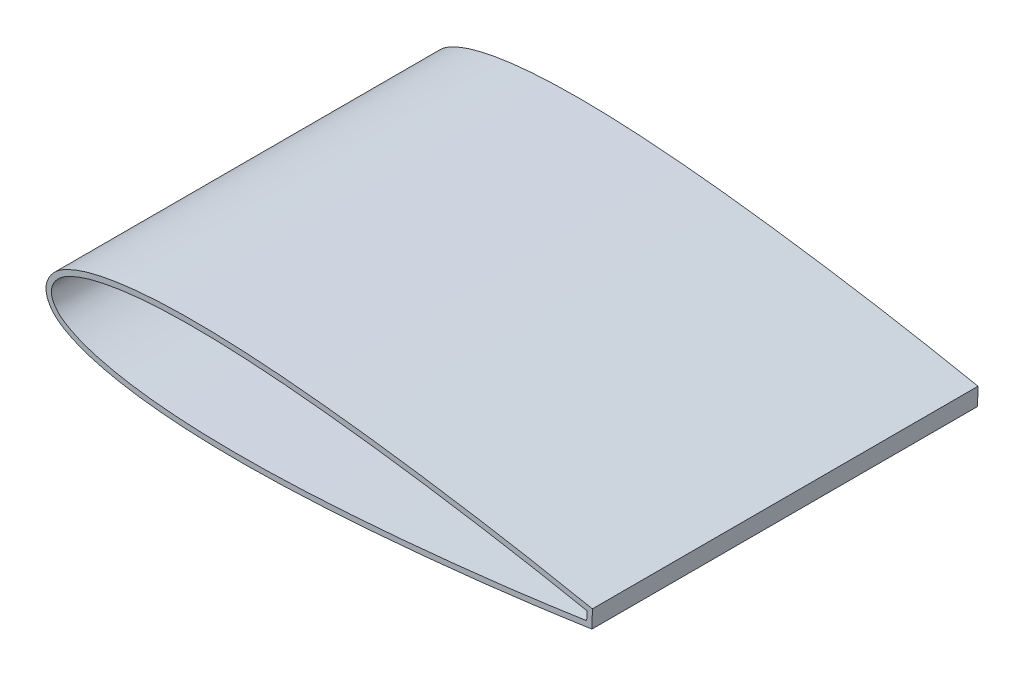
ISO-10303-21;
HEADER;
FILE_DESCRIPTION(('STEP AP214'),'2;1');
FILE_NAME('part.step','',(''),(''),'','','');
FILE_SCHEMA(('AUTOMOTIVE_DESIGN { 1 0 10303 214 1 1 1 1 }'));
ENDSEC;
DATA;
#1=APPLICATION_CONTEXT('core data for automotive mechanical design processes');
#2=APPLICATION_PROTOCOL_DEFINITION('international standard','automotive_design',2000,#1);
#3=PRODUCT_CONTEXT('',#1,'mechanical');
#4=PRODUCT('Part','Part','',(#3));
#5=PRODUCT_RELATED_PRODUCT_CATEGORY('part','',(#4));
#6=PRODUCT_DEFINITION_FORMATION('','',#4);
#7=PRODUCT_DEFINITION_CONTEXT('part definition',#1,'design');
#8=PRODUCT_DEFINITION('design','',#6,#7);
#9=PRODUCT_DEFINITION_SHAPE('','',#8);
#10=(LENGTH_UNIT() NAMED_UNIT(*) SI_UNIT(.MILLI.,.METRE.));
#11=(NAMED_UNIT(*) PLANE_ANGLE_UNIT() SI_UNIT($,.RADIAN.));
#12=(NAMED_UNIT(*) SI_UNIT($,.STERADIAN.) SOLID_ANGLE_UNIT());
#13=UNCERTAINTY_MEASURE_WITH_UNIT(LENGTH_MEASURE(1.E-05),#10,'distance_accuracy_value','');
#14=(GEOMETRIC_REPRESENTATION_CONTEXT(3) GLOBAL_UNCERTAINTY_ASSIGNED_CONTEXT((#13)) GLOBAL_UNIT_ASSIGNED_CONTEXT((#10,
#11,#12)) REPRESENTATION_CONTEXT('',''));
#15=CARTESIAN_POINT('',(0.,0.,0.));
#16=DIRECTION('',(0.,0.,1.));
#17=DIRECTION('',(1.,0.,0.));
#18=AXIS2_PLACEMENT_3D('',#15,#16,#17);
#19=CARTESIAN_POINT('',(-1.00322117115779,-0.059648781360537,70.));
#20=DIRECTION('',(0.,0.,-1.));
#21=DIRECTION('',(-1.,0.,0.));
#22=AXIS2_PLACEMENT_3D('',#19,#20,#21);
#23=PLANE('',#22);
#24=CARTESIAN_POINT('',(101.020891316469,-0.965925893531055,70.));
#25=CARTESIAN_POINT('',(96.8152914072579,-0.132900663366544,70.));
#26=CARTESIAN_POINT('',(88.3989455311931,1.49830152936529,70.));
#27=CARTESIAN_POINT('',(75.7012801730482,3.61911795290207,70.));
#28=CARTESIAN_POINT('',(65.092277680627,5.17442040629899,70.));
#29=CARTESIAN_POINT('',(56.5758124258458,6.26109804007391,70.));
#30=CARTESIAN_POINT('',(50.1729820609848,6.98171199736559,70.));
#31=CARTESIAN_POINT('',(43.7515724861816,7.59342427106694,70.));
#32=CARTESIAN_POINT('',(37.3087920994638,8.06198949486387,70.));
#33=CARTESIAN_POINT('',(30.8435273076752,8.35213974278161,70.));
#34=CARTESIAN_POINT('',(25.435555721198,8.40190442161582,70.));
#35=CARTESIAN_POINT('',(21.0964250966995,8.2838016008448,70.));
#36=CARTESIAN_POINT('',(17.8368331692398,8.09868892693585,70.));
#37=CARTESIAN_POINT('',(14.5726166555898,7.79940361911627,70.));
#38=CARTESIAN_POINT('',(11.3001793371263,7.34974690192829,70.));
#39=CARTESIAN_POINT('',(8.57843484804564,6.80839239538331,70.));
#40=CARTESIAN_POINT('',(6.39638322415199,6.23175009949422,70.));
#41=CARTESIAN_POINT('',(4.74545181220282,5.6829921152092,70.));
#42=CARTESIAN_POINT('',(3.12508064154561,4.98825619350514,70.));
#43=CARTESIAN_POINT('',(1.50276495800015,4.12004959882355,70.));
#44=CARTESIAN_POINT('',(0.0700033633555216,2.83555842326763,70.));
#45=CARTESIAN_POINT('',(-0.776195718574706,1.33145153292227,70.));
#46=CARTESIAN_POINT('',(-1.09916170922084,-0.0572333539656266,70.));
#47=CARTESIAN_POINT('',(-0.846484471488702,-1.46041080522307,70.));
#48=CARTESIAN_POINT('',(-0.0770451362163298,-3.00519348676114,70.));
#49=CARTESIAN_POINT('',(1.28926481807951,-4.36015491645666,70.));
#50=CARTESIAN_POINT('',(2.86583644744456,-5.30889764533938,70.));
#51=CARTESIAN_POINT('',(4.44919519251474,-6.08429162004691,70.));
#52=CARTESIAN_POINT('',(6.07042117395669,-6.71543040777491,70.));
#53=CARTESIAN_POINT('',(8.22069133913145,-7.40114451985403,70.));
#54=CARTESIAN_POINT('',(10.911746344812,-8.07877326924399,70.));
#55=CARTESIAN_POINT('',(14.1574108099613,-8.69253164698817,70.));
#56=CARTESIAN_POINT('',(17.4024316792176,-9.15569544258697,70.));
#57=CARTESIAN_POINT('',(20.6485790675961,-9.50459853590282,70.));
#58=CARTESIAN_POINT('',(24.9762694800653,-9.84089980940212,70.));
#59=CARTESIAN_POINT('',(30.3798939614377,-10.0633310745554,70.));
#60=CARTESIAN_POINT('',(36.8515685445446,-10.0988850430511,70.));
#61=CARTESIAN_POINT('',(43.3097651736991,-9.95511863666826,70.));
#62=CARTESIAN_POINT('',(49.7538213246545,-9.66731113762591,70.));
#63=CARTESIAN_POINT('',(56.1848018120441,-9.2698050025246,70.));
#64=CARTESIAN_POINT('',(64.7451600282889,-8.6130585330137,70.));
#65=CARTESIAN_POINT('',(75.4189859976582,-7.5935788709535,70.));
#66=CARTESIAN_POINT('',(88.2072857861862,-6.11440465250787,70.));
#67=CARTESIAN_POINT('',(96.6950523189777,-4.90878539919806,70.));
#68=CARTESIAN_POINT('',(100.937242610845,-4.288444236581,70.));
#69=B_SPLINE_CURVE_WITH_KNOTS('',3,(#24,#25,#26,#27,#28,#29,#30,#31,#32,#33,#34,#35,#36,#37,#38,
#39,#40,#41,#42,#43,#44,#45,#46,#47,#48,#49,#50,#51,#52,#53,#54,#55,#56,#57,#58,#59,#60,#61,#62,
#63,#64,#65,#66,#67,#68),.UNSPECIFIED.,.F.,.F.,(4,1,1,1,1,1,1,1,1,1,1,1,1,1,1,1,1,1,1,1,1,1,1,1,
1,1,1,1,1,1,1,1,1,1,1,1,1,1,1,1,1,1,4),(-0.00744207168561099,0.0559881872750902,
0.119418446235791,0.182848705196492,0.214563834676843,0.246278964157194,0.277994093637544,
0.309709223117895,0.341424352598245,0.373139482078596,0.388997046818771,0.404854611558947,
0.420712176299122,0.436569741039297,0.452427305779472,0.46035608814956,0.468284870519648,
0.476213652889735,0.484142435259823,0.492071217629911,0.496035608814954,0.499999999999998,
0.503964391185042,0.507928782370086,0.515857564740174,0.523786347110261,0.531715129480349,
0.539643911850436,0.547572694220524,0.563430258960699,0.579287823700875,0.59514538844105,
0.611002953181225,0.626860517921401,0.658575647401751,0.690290776882102,0.722005906362452,
0.753721035842803,0.785436165323153,0.817151294803504,0.880581553764205,0.944011812724906,
1.00744207168561),.UNSPECIFIED.);
#70=CARTESIAN_POINT('',(101.020891316469,-0.965925893531055,70.));
#71=VERTEX_POINT('',#70);
#72=CARTESIAN_POINT('',(100.937242610845,-4.288444236581,70.));
#73=VERTEX_POINT('',#72);
#74=EDGE_CURVE('E172',#71,#73,#69,.T.);
#75=ORIENTED_EDGE('',*,*,#74,.T.);
#76=DIRECTION('',(0.0251683209518781,0.999683227637867,0.));
#77=VECTOR('',#76,1.);
#78=CARTESIAN_POINT('',(100.937242610845,-4.288444236581,70.));
#79=LINE('',#78,#77);
#80=EDGE_CURVE('E85',#73,#71,#79,.T.);
#81=ORIENTED_EDGE('',*,*,#80,.T.);
#82=EDGE_LOOP('',(#75,#81));
#83=FACE_BOUND('',#82,.T.);
#84=CARTESIAN_POINT('',(100.,-1.78314077070164,70.));
#85=CARTESIAN_POINT('',(95.8344302262288,-0.958044519400651,70.));
#86=CARTESIAN_POINT('',(87.4933415029602,0.643007475734244,70.));
#87=CARTESIAN_POINT('',(74.9228307102898,2.727733466838,70.));
#88=CARTESIAN_POINT('',(62.3137388745588,4.56407590292309,70.));
#89=CARTESIAN_POINT('',(49.6568863254094,6.08476504519193,70.));
#90=CARTESIAN_POINT('',(39.060280253504,6.9894175850786,70.));
#91=CARTESIAN_POINT('',(30.5506947326384,7.35911100239499,70.));
#92=CARTESIAN_POINT('',(24.1546022363876,7.40791291697808,70.));
#93=CARTESIAN_POINT('',(18.8173066638483,7.18883232048265,70.));
#94=CARTESIAN_POINT('',(14.5521032806025,6.78995235405887,70.));
#95=CARTESIAN_POINT('',(11.3582120521434,6.34453577093204,70.));
#96=CARTESIAN_POINT('',(8.18556520798904,5.70661083590564,70.));
#97=CARTESIAN_POINT('',(5.56395062132693,4.94882342356473,70.));
#98=CARTESIAN_POINT('',(3.51112318939389,4.06369616005844,70.));
#99=CARTESIAN_POINT('',(2.04186782763618,3.26373643769958,70.));
#100=CARTESIAN_POINT('',(0.599002867417681,1.95255465334258,70.));
#101=CARTESIAN_POINT('',(-0.278987019425599,-0.0778823148154465,70.));
#102=CARTESIAN_POINT('',(0.495717549165106,-2.14992800795706,70.));
#103=CARTESIAN_POINT('',(1.87077497916579,-3.53205464081528,70.));
#104=CARTESIAN_POINT('',(3.29791442730337,-4.40493485654925,70.));
#105=CARTESIAN_POINT('',(5.30360093471831,-5.39224046874472,70.));
#106=CARTESIAN_POINT('',(7.88376183683115,-6.28098932107028,70.));
#107=CARTESIAN_POINT('',(11.0202884632237,-7.07775587557813,70.));
#108=CARTESIAN_POINT('',(14.187719714027,-7.68332699707143,70.));
#109=CARTESIAN_POINT('',(18.4274476412627,-8.29632963253289,70.));
#110=CARTESIAN_POINT('',(23.7469571658001,-8.78370910970098,70.));
#111=CARTESIAN_POINT('',(30.137402270705,-9.0568248519408,70.));
#112=CARTESIAN_POINT('',(38.6548103236351,-9.1158080666408,70.));
#113=CARTESIAN_POINT('',(49.2835144204537,-8.74553022051303,70.));
#114=CARTESIAN_POINT('',(62.0008542824053,-7.86366925984795,70.));
#115=CARTESIAN_POINT('',(74.6863778320927,-6.66415155060477,70.));
#116=CARTESIAN_POINT('',(87.3458680501336,-5.21462353571256,70.));
#117=CARTESIAN_POINT('',(95.7569555936226,-4.03532929069693,70.));
#118=CARTESIAN_POINT('',(99.9587674720381,-3.42089271750701,70.));
#119=B_SPLINE_CURVE_WITH_KNOTS('',3,(#84,#85,#86,#87,#88,#89,#90,#91,#92,#93,#94,#95,#96,#97,
#98,#99,#100,#101,#102,#103,#104,#105,#106,#107,#108,#109,#110,#111,#112,#113,#114,#115,#116,
#117,#118),.UNSPECIFIED.,.F.,.F.,(4,1,1,1,1,1,1,1,1,1,1,1,1,1,1,1,1,1,1,1,1,1,1,1,1,1,1,1,1,1,1,
1,4),(-0.00328090173750234,0.0596292109796854,0.122539323696873,0.185449436414061,
0.248359549131249,0.311269661848436,0.34272471820703,0.374179774565624,0.405634830924218,
0.421362359103515,0.437089887282812,0.452817415462109,0.468544943641406,0.476408707731054,
0.484272471820703,0.492136235910351,0.5,0.507863764089648,0.515727528179296,0.523591292268945,
0.531455056358593,0.54718258453789,0.562910112717187,0.578637640896484,0.594365169075781,
0.625820225434375,0.657275281792969,0.688730338151563,0.75164045086875,0.814550563585938,
0.877460676303126,0.940370789020314,1.0032809017375),.UNSPECIFIED.);
#120=CARTESIAN_POINT('',(100.,-1.78314077070164,70.));
#121=VERTEX_POINT('',#120);
#122=CARTESIAN_POINT('',(99.9587674720381,-3.42089271750701,70.));
#123=VERTEX_POINT('',#122);
#124=EDGE_CURVE('E101',#121,#123,#119,.T.);
#125=ORIENTED_EDGE('',*,*,#124,.F.);
#126=DIRECTION('',(0.0251683209517833,0.999683227637869,0.));
#127=VECTOR('',#126,1.);
#128=CARTESIAN_POINT('',(99.9587674720381,-3.42089271750701,70.));
#129=LINE('',#128,#127);
#130=EDGE_CURVE('E175',#123,#121,#129,.T.);
#131=ORIENTED_EDGE('',*,*,#130,.F.);
#132=EDGE_LOOP('',(#125,#131));
#133=FACE_BOUND('',#132,.T.);
#134=ADVANCED_FACE('F37',(#83,#133),#23,.F.);
#135=DIRECTION('',(0.,0.,-1.));
#136=VECTOR('',#135,1.);
#137=SURFACE_OF_LINEAR_EXTRUSION('',#69,#136);
#138=DIRECTION('',(0.,0.,-1.));
#139=VECTOR('',#138,1.);
#140=CARTESIAN_POINT('',(101.020891316469,-0.965925893531055,70.));
#141=LINE('',#140,#139);
#142=CARTESIAN_POINT('',(101.020891316469,-0.965925893531055,-2.));
#143=VERTEX_POINT('',#142);
#144=EDGE_CURVE('E47',#71,#143,#141,.T.);
#145=ORIENTED_EDGE('',*,*,#144,.T.);
#146=CARTESIAN_POINT('',(100.937242610845,-4.288444236581,-2.));
#147=CARTESIAN_POINT('',(99.876048925615,-4.4436211339548,-2.));
#148=CARTESIAN_POINT('',(98.814696636485,-4.59771294948539,-2.));
#149=CARTESIAN_POINT('',(96.6914939606541,-4.90253918519001,-2.));
#150=CARTESIAN_POINT('',(95.6296435665199,-5.05327355351854,-2.));
#151=CARTESIAN_POINT('',(92.414428288785,-5.50266307594665,-2.));
#152=CARTESIAN_POINT('',(90.2600588829281,-5.79424652564887,-2.));
#153=CARTESIAN_POINT('',(85.9245235779079,-6.35198444563104,-2.));
#154=CARTESIAN_POINT('',(83.7433180801583,-6.61783267319582,-2.));
#155=CARTESIAN_POINT('',(80.8271914517352,-6.95601395759061,-2.));
#156=CARTESIAN_POINT('',(80.0935569438925,-7.03963685425996,-2.));
#157=CARTESIAN_POINT('',(78.625978708156,-7.20412971058293,-2.));
#158=CARTESIAN_POINT('',(77.8920349805453,-7.28499967274979,-2.));
#159=CARTESIAN_POINT('',(76.4238645459665,-7.44412739835826,-2.));
#160=CARTESIAN_POINT('',(75.6896378388321,-7.52238516026244,-2.));
#161=CARTESIAN_POINT('',(74.2168187936958,-7.67680505678082,-2.));
#162=CARTESIAN_POINT('',(73.4782249720661,-7.75295304918208,-2.));
#163=CARTESIAN_POINT('',(72.00076568911,-7.9025627792338,-2.));
#164=CARTESIAN_POINT('',(71.2619002279724,-7.97602451874753,-2.));
#165=CARTESIAN_POINT('',(69.7838971676636,-8.12015649853246,-2.));
#166=CARTESIAN_POINT('',(69.0447595685713,-8.19082673961318,-2.));
#167=CARTESIAN_POINT('',(67.5639140885411,-8.32947983944264,-2.));
#168=CARTESIAN_POINT('',(66.8222053609176,-8.3974536601769,-2.));
#169=CARTESIAN_POINT('',(65.3385154183688,-8.53036762632486,-2.));
#170=CARTESIAN_POINT('',(64.5965342032507,-8.59530776958765,-2.));
#171=CARTESIAN_POINT('',(63.1123030068729,-8.72205425840304,-2.));
#172=CARTESIAN_POINT('',(62.3700530251867,-8.78386059896168,-2.));
#173=CARTESIAN_POINT('',(60.6702961791958,-8.92160579938587,-2.));
#174=CARTESIAN_POINT('',(59.7127005835631,-8.99645400199829,-2.));
#175=CARTESIAN_POINT('',(57.7970604804058,-9.14019925022991,-2.));
#176=CARTESIAN_POINT('',(56.8390159721293,-9.20909628584681,-2.));
#177=CARTESIAN_POINT('',(54.9224815960169,-9.3404862507936,-2.));
#178=CARTESIAN_POINT('',(53.963991725804,-9.40297914554104,-2.));
#179=CARTESIAN_POINT('',(52.0480243573676,-9.52102582384489,-2.));
#180=CARTESIAN_POINT('',(51.0905474917283,-9.57658985564231,-2.));
#181=CARTESIAN_POINT('',(49.1752024645996,-9.68049541975074,-2.));
#182=CARTESIAN_POINT('',(48.2173343040052,-9.7288369684912,-2.));
#183=CARTESIAN_POINT('',(46.301222240332,-9.81734757016264,-2.));
#184=CARTESIAN_POINT('',(45.3429783391351,-9.85751666351474,-2.));
#185=CARTESIAN_POINT('',(43.4299788037973,-9.92852706077323,-2.));
#186=CARTESIAN_POINT('',(42.4752245430876,-9.95940502148034,-2.));
#187=CARTESIAN_POINT('',(40.5654332341082,-10.0110396013984,-2.));
#188=CARTESIAN_POINT('',(39.6103961841864,-10.0317961602639,-2.));
#189=CARTESIAN_POINT('',(37.7001124363002,-10.0622188611542,-2.));
#190=CARTESIAN_POINT('',(36.7448657328417,-10.0718846657635,-2.));
#191=CARTESIAN_POINT('',(34.8399271822113,-10.0789333306864,-2.));
#192=CARTESIAN_POINT('',(33.8902356339696,-10.07638793968,-2.));
#193=CARTESIAN_POINT('',(31.9910003729539,-10.0576988781726,-2.));
#194=CARTESIAN_POINT('',(31.0414566573591,-10.0415555104423,-2.));
#195=CARTESIAN_POINT('',(29.1427979240686,-9.99419598040804,-2.));
#196=CARTESIAN_POINT('',(28.1936828827641,-9.96298078584784,-2.));
#197=CARTESIAN_POINT('',(26.3021931574134,-9.88332472157658,-2.));
#198=CARTESIAN_POINT('',(25.3598139594559,-9.83499454882057,-2.));
#199=CARTESIAN_POINT('',(23.9471140796724,-9.74792782522012,-2.));
#200=CARTESIAN_POINT('',(23.4763378162684,-9.71647526681721,-2.));
#201=CARTESIAN_POINT('',(22.5351630224023,-9.64832166745369,-2.));
#202=CARTESIAN_POINT('',(22.0647644912443,-9.61162063618499,-2.));
#203=CARTESIAN_POINT('',(21.1242817734579,-9.53248170069778,-2.));
#204=CARTESIAN_POINT('',(20.6541977560653,-9.49004177897489,-2.));
#205=CARTESIAN_POINT('',(19.71462451384,-9.39898768365309,-2.));
#206=CARTESIAN_POINT('',(19.2451352907087,-9.35037349243266,-2.));
#207=CARTESIAN_POINT('',(18.3075421216353,-9.24660106610844,-2.));
#208=CARTESIAN_POINT('',(17.8394371568319,-9.19145205787048,-2.));
#209=CARTESIAN_POINT('',(16.9041073805686,-9.07412341499306,-2.));
#210=CARTESIAN_POINT('',(16.4368825654825,-9.01194380938506,-2.));
#211=CARTESIAN_POINT('',(15.5036744025738,-8.87966017559813,-2.));
#212=CARTESIAN_POINT('',(15.0376907650058,-8.80955820041357,-2.));
#213=CARTESIAN_POINT('',(14.1071066800859,-8.66061366014942,-2.));
#214=CARTESIAN_POINT('',(13.6425062588231,-8.581770931269,-2.));
#215=CARTESIAN_POINT('',(12.7153359850571,-8.41428129474856,-2.));
#216=CARTESIAN_POINT('',(12.25276514888,-8.32563985151775,-2.));
#217=CARTESIAN_POINT('',(11.3298756998091,-8.13738305144831,-2.));
#218=CARTESIAN_POINT('',(10.8695569340212,-8.03776845069016,-2.));
#219=CARTESIAN_POINT('',(10.22553393746,-7.88932798146915,-2.));
#220=CARTESIAN_POINT('',(10.0406338963462,-7.8456551498437,-2.));
#221=CARTESIAN_POINT('',(9.67135119516788,-7.7561671084356,-2.));
#222=CARTESIAN_POINT('',(9.48696853579342,-7.71035189579696,-2.));
#223=CARTESIAN_POINT('',(9.11869524732595,-7.61645227282149,-2.));
#224=CARTESIAN_POINT('',(8.93480487068835,-7.56836687200275,-2.));
#225=CARTESIAN_POINT('',(8.56765557034172,-7.46983738138947,-2.));
#226=CARTESIAN_POINT('',(8.38439664951345,-7.4193932808495,-2.));
#227=CARTESIAN_POINT('',(8.01849150978227,-7.31603082083331,-2.));
#228=CARTESIAN_POINT('',(7.83584559241313,-7.26311139355718,-2.));
#229=CARTESIAN_POINT('',(7.4713135254854,-7.15471288388027,-2.));
#230=CARTESIAN_POINT('',(7.28942737513937,-7.09923380413313,-2.));
#231=CARTESIAN_POINT('',(6.92773305059613,-6.9856161217389,-2.));
#232=CARTESIAN_POINT('',(6.74791899369977,-6.92749630352489,-2.));
#233=CARTESIAN_POINT('',(6.38941236233546,-6.8078900719144,-2.));
#234=CARTESIAN_POINT('',(6.21071978286423,-6.74640367354928,-2.));
#235=CARTESIAN_POINT('',(5.85470953445288,-6.61974436233808,-2.));
#236=CARTESIAN_POINT('',(5.67739143124323,-6.55457267276336,-2.));
#237=CARTESIAN_POINT('',(5.32428879883447,-6.42018556765714,-2.));
#238=CARTESIAN_POINT('',(5.14850428613118,-6.35097010869098,-2.));
#239=CARTESIAN_POINT('',(4.79882253712284,-6.20819925974412,-2.));
#240=CARTESIAN_POINT('',(4.62492425910159,-6.13464642657308,-2.));
#241=CARTESIAN_POINT('',(4.27920356950343,-5.98282910878774,-2.));
#242=CARTESIAN_POINT('',(4.10738104820209,-5.90456487453794,-2.));
#243=CARTESIAN_POINT('',(3.80722175508821,-5.76280917825111,-2.));
#244=CARTESIAN_POINT('',(3.67841097867518,-5.70031855927824,-2.));
#245=CARTESIAN_POINT('',(3.4221087087578,-5.57264914020639,-2.));
#246=CARTESIAN_POINT('',(3.29461736121043,-5.50747004659805,-2.));
#247=CARTESIAN_POINT('',(3.10441239893892,-5.40770963031091,-2.));
#248=CARTESIAN_POINT('',(3.04117625121146,-5.37412060938886,-2.));
#249=CARTESIAN_POINT('',(2.91504702696523,-5.30630318968236,-2.));
#250=CARTESIAN_POINT('',(2.85215395230048,-5.272074787447,-2.));
#251=CARTESIAN_POINT('',(2.72666909264015,-5.20285942465438,-2.));
#252=CARTESIAN_POINT('',(2.66407786189751,-5.16787145650822,-2.));
#253=CARTESIAN_POINT('',(2.53941073575201,-5.09699051789263,-2.));
#254=CARTESIAN_POINT('',(2.47733483663516,-5.06109755395305,-2.));
#255=CARTESIAN_POINT('',(2.29207134962473,-4.95185066688746,-2.));
#256=CARTESIAN_POINT('',(2.16981056765025,-4.87690838276518,-2.));
#257=CARTESIAN_POINT('',(1.92857325958476,-4.72188171766794,-2.));
#258=CARTESIAN_POINT('',(1.80959677771728,-4.6417972675013,-2.));
#259=CARTESIAN_POINT('',(1.60337873003884,-4.49573125412541,-2.));
#260=CARTESIAN_POINT('',(1.51530993346956,-4.43091635426724,-2.));
#261=CARTESIAN_POINT('',(1.34164967731459,-4.29803544375862,-2.));
#262=CARTESIAN_POINT('',(1.25605837460725,-4.22996922795044,-2.));
#263=CARTESIAN_POINT('',(1.08759236708112,-4.09053614288333,-2.));
#264=CARTESIAN_POINT('',(1.00471775323439,-4.01916916328633,-2.));
#265=CARTESIAN_POINT('',(0.842105846147469,-3.87296535515805,-2.));
#266=CARTESIAN_POINT('',(0.762368466811954,-3.79812862197039,-2.));
#267=CARTESIAN_POINT('',(0.528935311284787,-3.56872521672869,-2.));
#268=CARTESIAN_POINT('',(0.380406115191541,-3.4087649573069,-2.));
#269=CARTESIAN_POINT('',(0.170433747776414,-3.15806010213646,-2.));
#270=CARTESIAN_POINT('',(0.102542710448644,-3.07264284738384,-2.));
#271=CARTESIAN_POINT('',(-0.0285936445398048,-2.89828399003354,-2.));
#272=CARTESIAN_POINT('',(-0.0918383972224047,-2.80934196084857,-2.));
#273=CARTESIAN_POINT('',(-0.227855947050874,-2.60649887125939,-2.));
#274=CARTESIAN_POINT('',(-0.299303446172271,-2.4917045016565,-2.));
#275=CARTESIAN_POINT('',(-0.433672746651762,-2.25718981273116,-2.));
#276=CARTESIAN_POINT('',(-0.496593411620822,-2.13746883959625,-2.));
#277=CARTESIAN_POINT('',(-0.612676629374555,-1.89360961589938,-2.));
#278=CARTESIAN_POINT('',(-0.665855266231681,-1.76947905767002,-2.));
#279=CARTESIAN_POINT('',(-0.761627133561068,-1.51724897754466,-2.));
#280=CARTESIAN_POINT('',(-0.804225677997618,-1.38915148459394,-2.));
#281=CARTESIAN_POINT('',(-0.871275207908976,-1.15373054155264,-2.));
#282=CARTESIAN_POINT('',(-0.897625372054255,-1.04694597473237,-2.));
#283=CARTESIAN_POINT('',(-0.942200613019407,-0.831714348481063,-2.));
#284=CARTESIAN_POINT('',(-0.960428262440093,-0.723267826704657,-2.));
#285=CARTESIAN_POINT('',(-0.987902293580838,-0.50548782878387,-2.));
#286=CARTESIAN_POINT('',(-0.997171778970058,-0.396157371529362,-2.));
#287=CARTESIAN_POINT('',(-1.00367190316051,-0.231902019736166,-2.));
#288=CARTESIAN_POINT('',(-1.00460466447592,-0.177108357912547,-2.));
#289=CARTESIAN_POINT('',(-1.00384052398554,-0.0675363984626097,-2.));
#290=CARTESIAN_POINT('',(-1.0021436952514,-0.0127581004516642,-2.00000000000002));
#291=CARTESIAN_POINT('',(-0.996159180301451,0.096701553651138,-2.00000000000002));
#292=CARTESIAN_POINT('',(-0.991869284901761,0.15138278716367,-2.));
#293=CARTESIAN_POINT('',(-0.980858577191678,0.260497876243125,-2.));
#294=CARTESIAN_POINT('',(-0.974137640031922,0.314931718959561,-2.));
#295=CARTESIAN_POINT('',(-0.950511890623783,0.47776889844627,-2.));
#296=CARTESIAN_POINT('',(-0.93014552215099,0.585684615010245,-2.));
#297=CARTESIAN_POINT('',(-0.88103884192028,0.799928881999769,-2.));
#298=CARTESIAN_POINT('',(-0.852271468574693,0.906251117221291,-2.));
#299=CARTESIAN_POINT('',(-0.787121812620898,1.11650917490412,-2.));
#300=CARTESIAN_POINT('',(-0.750740462559891,1.22044528788534,-2.00000000000001));
#301=CARTESIAN_POINT('',(-0.657265051090361,1.46033354528192,-2.00000000000002));
#302=CARTESIAN_POINT('',(-0.597331225874358,1.59518628943953,-2.));
#303=CARTESIAN_POINT('',(-0.465750229355705,1.85906509550025,-2.));
#304=CARTESIAN_POINT('',(-0.394099003702713,1.98808912081066,-2.));
#305=CARTESIAN_POINT('',(-0.240606174155722,2.23968208078803,-2.));
#306=CARTESIAN_POINT('',(-0.158776929852478,2.36225859234919,-2.));
#307=CARTESIAN_POINT('',(0.0137911666137622,2.60094478424662,-2.));
#308=CARTESIAN_POINT('',(0.104530366041761,2.71705421225205,-2.));
#309=CARTESIAN_POINT('',(0.32809890811802,2.98281821923955,-2.));
#310=CARTESIAN_POINT('',(0.464364167277283,3.12959472456311,-2.));
#311=CARTESIAN_POINT('',(0.749470370516614,3.41033276517798,-2.));
#312=CARTESIAN_POINT('',(0.898314528379842,3.54429100677714,-2.));
#313=CARTESIAN_POINT('',(1.20656274462563,3.80024481616814,-2.));
#314=CARTESIAN_POINT('',(1.36599317539223,3.92220847525983,-2.));
#315=CARTESIAN_POINT('',(1.61110268252865,4.09667354153988,-2.));
#316=CARTESIAN_POINT('',(1.69380844276444,4.15342043826633,-2.));
#317=CARTESIAN_POINT('',(1.86110499970898,4.26406294999952,-2.));
#318=CARTESIAN_POINT('',(1.9456956908955,4.31795872405075,-2.));
#319=CARTESIAN_POINT('',(2.14152262737607,4.43831739978814,-2.));
#320=CARTESIAN_POINT('',(2.25332729566672,4.50385491726743,-2.));
#321=CARTESIAN_POINT('',(2.47928619730091,4.6307529299799,-2.));
#322=CARTESIAN_POINT('',(2.59344068837807,4.69211296380412,-2.));
#323=CARTESIAN_POINT('',(2.82367822580222,4.81146621223148,-2.));
#324=CARTESIAN_POINT('',(2.93976364055447,4.86945482878919,-2.));
#325=CARTESIAN_POINT('',(3.11475460542424,4.95464768391368,-2.));
#326=CARTESIAN_POINT('',(3.17322885759926,4.9827470143391,-2.));
#327=CARTESIAN_POINT('',(3.29043281723274,5.03840789299241,-2.));
#328=CARTESIAN_POINT('',(3.34916252363064,5.06596944345038,-2.));
#329=CARTESIAN_POINT('',(3.52589842736233,5.14789260500171,-2.));
#330=CARTESIAN_POINT('',(3.64429452089423,5.20141636155524,-2.));
#331=CARTESIAN_POINT('',(3.88207390342093,5.30620803673021,-2.));
#332=CARTESIAN_POINT('',(4.0014571633606,5.35747602146671,-2.));
#333=CARTESIAN_POINT('',(4.36102054928805,5.50784075452391,-2.));
#334=CARTESIAN_POINT('',(4.60264434240163,5.60351222244398,-2.));
#335=CARTESIAN_POINT('',(5.09113358216484,5.7865146378527,-2.));
#336=CARTESIAN_POINT('',(5.33802505368448,5.8737757553583,-2.));
#337=CARTESIAN_POINT('',(5.83421312707276,6.04001100506207,-2.));
#338=CARTESIAN_POINT('',(6.08350618748667,6.11899575635864,-2.));
#339=CARTESIAN_POINT('',(6.58412577522355,6.26967698285197,-2.));
#340=CARTESIAN_POINT('',(6.83545110741739,6.34137744679906,-2.));
#341=CARTESIAN_POINT('',(7.33976893862559,6.47845284536508,-2.));
#342=CARTESIAN_POINT('',(7.59276117277019,6.54382876023839,-2.));
#343=CARTESIAN_POINT('',(8.07278180493069,6.66273567824873,-2.));
#344=CARTESIAN_POINT('',(8.29968268985348,6.71678489764141,-2.));
#345=CARTESIAN_POINT('',(8.75434115265163,6.8211651599718,-2.));
#346=CARTESIAN_POINT('',(8.98209874263003,6.87149615017149,-2.));
#347=CARTESIAN_POINT('',(9.43839662443621,6.96858731476244,-2.));
#348=CARTESIAN_POINT('',(9.66693699296339,7.01534712813424,-2.));
#349=CARTESIAN_POINT('',(10.1246775290228,7.10550569171752,-2.));
#350=CARTESIAN_POINT('',(10.3538776937585,7.14890445615241,-2.));
#351=CARTESIAN_POINT('',(10.8132139749209,7.23262154713727,-2.));
#352=CARTESIAN_POINT('',(11.043350998648,7.27293488800208,-2.));
#353=CARTESIAN_POINT('',(11.5041161945259,7.35064060644167,-2.));
#354=CARTESIAN_POINT('',(11.7347443675351,7.38803297890731,-2.));
#355=CARTESIAN_POINT('',(12.4272585254518,7.49603730025552,-2.));
#356=CARTESIAN_POINT('',(12.8897993835066,7.56248101345783,-2.));
#357=CARTESIAN_POINT('',(13.816939364427,7.68550722006926,-2.));
#358=CARTESIAN_POINT('',(14.2815406091035,7.74207354021717,-2.));
#359=CARTESIAN_POINT('',(15.2117325905404,7.84637225727681,-2.));
#360=CARTESIAN_POINT('',(15.6773233349409,7.89410458572737,-2.));
#361=CARTESIAN_POINT('',(16.6093618205189,7.98154438635581,-2.));
#362=CARTESIAN_POINT('',(17.0758097361263,8.02124998582445,-2.));
#363=CARTESIAN_POINT('',(18.0092513111193,8.09354999590448,-2.));
#364=CARTESIAN_POINT('',(18.4762449692755,8.12614442250499,-2.));
#365=CARTESIAN_POINT('',(19.4108550337217,8.18474233548506,-2.));
#366=CARTESIAN_POINT('',(19.8784716256199,8.21074285137688,-2.));
#367=CARTESIAN_POINT('',(20.8140036940075,8.25654777907569,-2.));
#368=CARTESIAN_POINT('',(21.2819191699661,8.27635220185585,-2.));
#369=CARTESIAN_POINT('',(22.6847668301794,8.32711052896327,-2.));
#370=CARTESIAN_POINT('',(23.6200160898046,8.34948335794383,-2.));
#371=CARTESIAN_POINT('',(25.4901275544974,8.37484387193887,-2.));
#372=CARTESIAN_POINT('',(26.4249896081688,8.37784432900789,-2.));
#373=CARTESIAN_POINT('',(28.2943856101104,8.36662029547898,-2.));
#374=CARTESIAN_POINT('',(29.2289195840191,8.35239982726939,-2.));
#375=CARTESIAN_POINT('',(30.7586860275051,8.3169070134027,-2.));
#376=CARTESIAN_POINT('',(31.3540280059856,8.30006392504503,-2.));
#377=CARTESIAN_POINT('',(32.5445274326752,8.26075981640582,-2.));
#378=CARTESIAN_POINT('',(33.1396848804951,8.23829878435275,-2.));
#379=CARTESIAN_POINT('',(34.9248535027486,8.16299214134209,-2.));
#380=CARTESIAN_POINT('',(36.1145350852399,8.10222361515168,-2.));
#381=CARTESIAN_POINT('',(38.4936166727136,7.96239760369272,-2.));
#382=CARTESIAN_POINT('',(39.6830159326194,7.88332767656883,-2.));
#383=CARTESIAN_POINT('',(42.0605973407014,7.70887663336891,-2.));
#384=CARTESIAN_POINT('',(43.2487795025882,7.61349570311343,-2.));
#385=CARTESIAN_POINT('',(45.6248861419255,7.40829997343476,-2.));
#386=CARTESIAN_POINT('',(46.8128095827044,7.29847323240001,-2.));
#387=CARTESIAN_POINT('',(48.5937753720213,7.12439278734404,-2.));
#388=CARTESIAN_POINT('',(49.1872794898567,7.06480902434974,-2.));
#389=CARTESIAN_POINT('',(50.3739938881975,6.94278256925793,-2.));
#390=CARTESIAN_POINT('',(50.9672041686879,6.880339877015,-2.));
#391=CARTESIAN_POINT('',(52.7469751799354,6.68885150042093,-2.));
#392=CARTESIAN_POINT('',(53.9330962754123,6.55570249896424,-2.));
#393=CARTESIAN_POINT('',(56.3041509985521,6.2792816430019,-2.));
#394=CARTESIAN_POINT('',(57.4890846291785,6.13600981382319,-2.));
#395=CARTESIAN_POINT('',(59.8577182533413,5.84021470638743,-2.));
#396=CARTESIAN_POINT('',(61.0414183204305,5.68769201613061,-2.));
#397=CARTESIAN_POINT('',(63.4077138315825,5.37431297604318,-2.));
#398=CARTESIAN_POINT('',(64.5903092747563,5.21345661951243,-2.));
#399=CARTESIAN_POINT('',(66.9536548749969,4.88404431441084,-2.));
#400=CARTESIAN_POINT('',(68.1344057286595,4.71549335955624,-2.));
#401=CARTESIAN_POINT('',(70.4948305770079,4.37102151661075,-2.));
#402=CARTESIAN_POINT('',(71.6745045719834,4.19510063050285,-2.));
#403=CARTESIAN_POINT('',(74.0321174520191,3.83649745374907,-2.));
#404=CARTESIAN_POINT('',(75.2100569483845,3.6538191783346,-2.));
#405=CARTESIAN_POINT('',(77.5649013619904,3.28190231447591,-2.));
#406=CARTESIAN_POINT('',(78.7418062780191,3.09266371835838,-2.));
#407=CARTESIAN_POINT('',(81.0940365229543,2.70707214802058,-2.));
#408=CARTESIAN_POINT('',(82.2693622561794,2.51072164552585,-2.));
#409=CARTESIAN_POINT('',(84.031364409618,2.21042860465732,-2.));
#410=CARTESIAN_POINT('',(84.6185334172562,2.10936982248812,-2.));
#411=CARTESIAN_POINT('',(85.7925256614719,1.90526279296585,-2.));
#412=CARTESIAN_POINT('',(86.3793488981584,1.80221454624015,-2.));
#413=CARTESIAN_POINT('',(87.5525789015593,1.59405965791401,-2.));
#414=CARTESIAN_POINT('',(88.1389856993732,1.48895319162408,-2.));
#415=CARTESIAN_POINT('',(89.3114203605264,1.27664782675586,-2.));
#416=CARTESIAN_POINT('',(89.8974482238128,1.16944892788621,-2.));
#417=CARTESIAN_POINT('',(91.0691603030837,0.953182355831434,-2.));
#418=CARTESIAN_POINT('',(91.6548445181932,0.844114677909869,-2.));
#419=CARTESIAN_POINT('',(92.8258986876611,0.624305935734486,-2.));
#420=CARTESIAN_POINT('',(93.4112686419829,0.513564871285593,-2.));
#421=CARTESIAN_POINT('',(95.1670783326385,0.179112604273989,-2.));
#422=CARTESIAN_POINT('',(96.3370977455839,-0.0468054104647031,-2.));
#423=CARTESIAN_POINT('',(98.6762989161073,-0.502917360694006,-2.));
#424=CARTESIAN_POINT('',(99.8454806745858,-0.733111291579973,-2.));
#425=CARTESIAN_POINT('',(101.016561907614,-0.965068349565086,-2.));
#426=CARTESIAN_POINT('',(101.018726612496,-0.965497119262526,-2.));
#427=CARTESIAN_POINT('',(101.020891316469,-0.965925893531055,-2.));
#428=B_SPLINE_CURVE_WITH_KNOTS('',3,(#146,#147,#148,#149,#150,#151,#152,#153,#154,#155,#156,
#157,#158,#159,#160,#161,#162,#163,#164,#165,#166,#167,#168,#169,#170,#171,#172,#173,#174,#175,
#176,#177,#178,#179,#180,#181,#182,#183,#184,#185,#186,#187,#188,#189,#190,#191,#192,#193,#194,
#195,#196,#197,#198,#199,#200,#201,#202,#203,#204,#205,#206,#207,#208,#209,#210,#211,#212,#213,
#214,#215,#216,#217,#218,#219,#220,#221,#222,#223,#224,#225,#226,#227,#228,#229,#230,#231,#232,
#233,#234,#235,#236,#237,#238,#239,#240,#241,#242,#243,#244,#245,#246,#247,#248,#249,#250,#251,
#252,#253,#254,#255,#256,#257,#258,#259,#260,#261,#262,#263,#264,#265,#266,#267,#268,#269,#270,
#271,#272,#273,#274,#275,#276,#277,#278,#279,#280,#281,#282,#283,#284,#285,#286,#287,#288,#289,
#290,#291,#292,#293,#294,#295,#296,#297,#298,#299,#300,#301,#302,#303,#304,#305,#306,#307,#308,
#309,#310,#311,#312,#313,#314,#315,#316,#317,#318,#319,#320,#321,#322,#323,#324,#325,#326,#327,
#328,#329,#330,#331,#332,#333,#334,#335,#336,#337,#338,#339,#340,#341,#342,#343,#344,#345,#346,
#347,#348,#349,#350,#351,#352,#353,#354,#355,#356,#357,#358,#359,#360,#361,#362,#363,#364,#365,
#366,#367,#368,#369,#370,#371,#372,#373,#374,#375,#376,#377,#378,#379,#380,#381,#382,#383,#384,
#385,#386,#387,#388,#389,#390,#391,#392,#393,#394,#395,#396,#397,#398,#399,#400,#401,#402,#403,
#404,#405,#406,#407,#408,#409,#410,#411,#412,#413,#414,#415,#416,#417,#418,#419,#420,#421,#422,
#423,#424,#425,#426,#427),.UNSPECIFIED.,.F.,.F.,(4,2,2,2,2,2,2,2,2,2,2,2,2,2,2,2,2,2,2,2,2,2,2,
2,2,2,2,2,2,2,2,2,2,2,2,2,2,2,2,2,2,2,2,2,2,2,2,2,2,2,2,2,2,2,2,2,2,2,2,2,2,2,2,2,2,2,2,2,2,2,2,
2,2,2,2,2,2,2,2,2,2,2,2,2,2,2,2,2,2,2,2,2,2,2,2,2,2,2,2,2,2,2,2,2,2,2,2,2,2,2,2,2,2,2,2,2,2,2,2,
2,2,2,2,2,2,2,2,2,2,2,2,2,2,2,2,2,2,2,2,2,4),(0.,3.21743546502254,6.43492057909294,
12.9568114951935,19.5486450273608,21.763798067322,23.9789490849474,26.1941014062989,
28.4216231908081,30.6491434302153,32.8766630236489,35.1111078705499,37.3455543016796,
39.5800042934726,42.4615356136407,45.3430717767831,48.2246234994426,51.1018613519559,
53.9790926593395,56.8563097355381,59.7220216656506,62.5877506814046,65.4535668792995,
68.3025652456328,71.1515001781968,74.0002522083967,76.8309057327654,78.2463596364576,
79.6618109263875,81.0777611175375,82.4937153499345,83.9076936223668,85.3216660562653,
86.7352729114382,88.1489062619339,89.5617552167741,90.9745068832877,91.5444604212873,
92.1144147191095,92.6846200281762,93.2548279351553,93.8252841271819,94.39573972782,
94.962630786819,95.5295193149272,96.0962207659129,96.6629283050345,97.2293050557064,
97.7956517355629,98.2251293113379,98.6546538992995,98.8694607448996,99.0842687502011,
99.2993816056097,99.5144929093518,99.9445878073439,100.374688493797,100.702661194442,
101.030654617542,101.358659012756,101.686654400238,102.340280427641,102.667489246668,
102.994737787943,103.400038797228,103.805393768818,104.210073346968,104.614549257571,
104.944228366059,105.273802982694,105.602525319133,105.766878110299,105.931226334473,
106.095714774169,106.260211662586,106.589275140966,106.919410526905,107.249505502049,
107.691574679541,108.133797142768,108.575487745881,109.0171955707,109.617089908023,
110.217137978422,110.818741442446,111.11960367229,111.420449101366,111.809135288695,
112.197864337546,112.587111677332,112.78173616284,112.976359841102,113.366130573318,
113.75588987401,114.535309131336,115.320724803097,116.105120068963,116.889083471788,
117.672925171243,118.372642404905,119.072369561198,119.772167361332,120.471962199871,
121.172864944013,121.87376891409,123.275499946196,124.679505080833,126.083521095693,
127.487864303231,128.892204353143,130.297175924247,131.702145007155,134.508429984919,
137.312864611675,140.116644317194,141.903360682025,143.690080790678,147.263598631445,
150.839553032376,154.415466697519,157.994355186508,159.78381200381,161.573268912135,
165.153930453977,168.734583037452,172.315008266673,175.895436374542,179.473572967396,
183.051708597502,186.627751221006,190.20379802739,193.778613693489,195.566017652558,
197.353421047978,199.140672856432,200.927924913749,202.715181501535,204.50243829767,
208.077318473121,211.652194799084,211.658815079752),.UNSPECIFIED.);
#429=CARTESIAN_POINT('',(100.937242610845,-4.288444236581,-2.));
#430=VERTEX_POINT('',#429);
#431=EDGE_CURVE('E92',#430,#143,#428,.T.);
#432=ORIENTED_EDGE('',*,*,#431,.F.);
#433=DIRECTION('',(0.,0.,-1.));
#434=VECTOR('',#433,1.);
#435=CARTESIAN_POINT('',(100.937242610845,-4.288444236581,70.));
#436=LINE('',#435,#434);
#437=EDGE_CURVE('E11',#73,#430,#436,.T.);
#438=ORIENTED_EDGE('',*,*,#437,.F.);
#439=ORIENTED_EDGE('',*,*,#74,.F.);
#440=EDGE_LOOP('',(#145,#432,#438,#439));
#441=FACE_BOUND('',#440,.T.);
#442=ADVANCED_FACE('F39',(#441),#137,.F.);
#443=CARTESIAN_POINT('',(100.937242610845,-4.288444236581,70.));
#444=DIRECTION('',(-0.999683227637867,0.0251683209518781,0.));
#445=DIRECTION('',(-0.0251683209518781,-0.999683227637867,0.));
#446=AXIS2_PLACEMENT_3D('',#443,#444,#445);
#447=PLANE('',#446);
#448=ORIENTED_EDGE('',*,*,#437,.T.);
#449=DIRECTION('',(-0.0251683209518781,-0.999683227637867,0.));
#450=VECTOR('',#449,1.);
#451=CARTESIAN_POINT('',(100.937242610845,-4.288444236581,-2.));
#452=LINE('',#451,#450);
#453=EDGE_CURVE('E83',#143,#430,#452,.T.);
#454=ORIENTED_EDGE('',*,*,#453,.F.);
#455=ORIENTED_EDGE('',*,*,#144,.F.);
#456=ORIENTED_EDGE('',*,*,#80,.F.);
#457=EDGE_LOOP('',(#448,#454,#455,#456));
#458=FACE_BOUND('',#457,.T.);
#459=ADVANCED_FACE('F81',(#458),#447,.F.);
#460=DIRECTION('',(0.,0.,-1.));
#461=VECTOR('',#460,1.);
#462=SURFACE_OF_LINEAR_EXTRUSION('',#119,#461);
#463=CARTESIAN_POINT('',(100.,-1.78314077070164,0.));
#464=CARTESIAN_POINT('',(95.8344302262288,-0.958044519400651,0.));
#465=CARTESIAN_POINT('',(87.4933415029602,0.643007475734244,0.));
#466=CARTESIAN_POINT('',(74.9228307102898,2.727733466838,0.));
#467=CARTESIAN_POINT('',(62.3137388745588,4.56407590292309,0.));
#468=CARTESIAN_POINT('',(49.6568863254094,6.08476504519193,0.));
#469=CARTESIAN_POINT('',(39.060280253504,6.9894175850786,0.));
#470=CARTESIAN_POINT('',(30.5506947326384,7.35911100239499,0.));
#471=CARTESIAN_POINT('',(24.1546022363876,7.40791291697808,0.));
#472=CARTESIAN_POINT('',(18.8173066638483,7.18883232048265,0.));
#473=CARTESIAN_POINT('',(14.5521032806025,6.78995235405887,0.));
#474=CARTESIAN_POINT('',(11.3582120521434,6.34453577093204,0.));
#475=CARTESIAN_POINT('',(8.18556520798904,5.70661083590564,0.));
#476=CARTESIAN_POINT('',(5.56395062132693,4.94882342356473,0.));
#477=CARTESIAN_POINT('',(3.51112318939389,4.06369616005844,0.));
#478=CARTESIAN_POINT('',(2.04186782763618,3.26373643769958,0.));
#479=CARTESIAN_POINT('',(0.599002867417681,1.95255465334258,0.));
#480=CARTESIAN_POINT('',(-0.278987019425599,-0.0778823148154465,0.));
#481=CARTESIAN_POINT('',(0.495717549165106,-2.14992800795706,0.));
#482=CARTESIAN_POINT('',(1.87077497916579,-3.53205464081528,0.));
#483=CARTESIAN_POINT('',(3.29791442730337,-4.40493485654925,0.));
#484=CARTESIAN_POINT('',(5.30360093471831,-5.39224046874472,0.));
#485=CARTESIAN_POINT('',(7.88376183683115,-6.28098932107028,0.));
#486=CARTESIAN_POINT('',(11.0202884632237,-7.07775587557813,0.));
#487=CARTESIAN_POINT('',(14.187719714027,-7.68332699707143,0.));
#488=CARTESIAN_POINT('',(18.4274476412627,-8.29632963253289,0.));
#489=CARTESIAN_POINT('',(23.7469571658001,-8.78370910970098,0.));
#490=CARTESIAN_POINT('',(30.137402270705,-9.0568248519408,0.));
#491=CARTESIAN_POINT('',(38.6548103236351,-9.1158080666408,0.));
#492=CARTESIAN_POINT('',(49.2835144204537,-8.74553022051303,0.));
#493=CARTESIAN_POINT('',(62.0008542824053,-7.86366925984795,0.));
#494=CARTESIAN_POINT('',(74.6863778320927,-6.66415155060477,0.));
#495=CARTESIAN_POINT('',(87.3458680501336,-5.21462353571256,0.));
#496=CARTESIAN_POINT('',(95.7569555936226,-4.03532929069693,0.));
#497=CARTESIAN_POINT('',(99.9587674720381,-3.42089271750701,0.));
#498=B_SPLINE_CURVE_WITH_KNOTS('',3,(#463,#464,#465,#466,#467,#468,#469,#470,#471,#472,#473,
#474,#475,#476,#477,#478,#479,#480,#481,#482,#483,#484,#485,#486,#487,#488,#489,#490,#491,#492,
#493,#494,#495,#496,#497),.UNSPECIFIED.,.F.,.F.,(4,1,1,1,1,1,1,1,1,1,1,1,1,1,1,1,1,1,1,1,1,1,1,
1,1,1,1,1,1,1,1,1,4),(-0.00328090173750234,0.0596292109796854,0.122539323696873,
0.185449436414061,0.248359549131249,0.311269661848436,0.34272471820703,0.374179774565624,
0.405634830924218,0.421362359103515,0.437089887282812,0.452817415462109,0.468544943641406,
0.476408707731054,0.484272471820703,0.492136235910351,0.5,0.507863764089648,0.515727528179296,
0.523591292268945,0.531455056358593,0.54718258453789,0.562910112717187,0.578637640896484,
0.594365169075781,0.625820225434375,0.657275281792969,0.688730338151563,0.75164045086875,
0.814550563585938,0.877460676303126,0.940370789020314,1.0032809017375),.UNSPECIFIED.);
#499=CARTESIAN_POINT('',(100.,-1.78314077070164,0.));
#500=VERTEX_POINT('',#499);
#501=CARTESIAN_POINT('',(99.9587674720381,-3.42089271750701,0.));
#502=VERTEX_POINT('',#501);
#503=EDGE_CURVE('E61',#500,#502,#498,.T.);
#504=ORIENTED_EDGE('',*,*,#503,.F.);
#505=DIRECTION('',(0.,0.,-1.));
#506=VECTOR('',#505,1.);
#507=CARTESIAN_POINT('',(100.,-1.78314077070164,70.));
#508=LINE('',#507,#506);
#509=EDGE_CURVE('E177',#121,#500,#508,.T.);
#510=ORIENTED_EDGE('',*,*,#509,.F.);
#511=ORIENTED_EDGE('',*,*,#124,.T.);
#512=DIRECTION('',(0.,0.,-1.));
#513=VECTOR('',#512,1.);
#514=CARTESIAN_POINT('',(99.9587674720381,-3.42089271750701,70.));
#515=LINE('',#514,#513);
#516=EDGE_CURVE('E54',#123,#502,#515,.T.);
#517=ORIENTED_EDGE('',*,*,#516,.T.);
#518=EDGE_LOOP('',(#504,#510,#511,#517));
#519=FACE_BOUND('',#518,.T.);
#520=ADVANCED_FACE('F116',(#519),#462,.T.);
#521=CARTESIAN_POINT('',(99.9587674720381,-3.42089271750701,70.));
#522=DIRECTION('',(-0.999683227637869,0.0251683209517833,0.));
#523=DIRECTION('',(-0.0251683209517833,-0.999683227637869,0.));
#524=AXIS2_PLACEMENT_3D('',#521,#522,#523);
#525=PLANE('',#524);
#526=DIRECTION('',(0.0251683209517833,0.999683227637869,0.));
#527=VECTOR('',#526,1.);
#528=CARTESIAN_POINT('',(99.9587674720381,-3.42089271750701,0.));
#529=LINE('',#528,#527);
#530=EDGE_CURVE('E176',#502,#500,#529,.T.);
#531=ORIENTED_EDGE('',*,*,#530,.F.);
#532=ORIENTED_EDGE('',*,*,#516,.F.);
#533=ORIENTED_EDGE('',*,*,#130,.T.);
#534=ORIENTED_EDGE('',*,*,#509,.T.);
#535=EDGE_LOOP('',(#531,#532,#533,#534));
#536=FACE_BOUND('',#535,.T.);
#537=ADVANCED_FACE('F112',(#536),#525,.T.);
#538=CARTESIAN_POINT('',(-1.00322117115779,-0.059648781360537,0.));
#539=DIRECTION('',(0.,0.,-1.));
#540=DIRECTION('',(-1.,0.,0.));
#541=AXIS2_PLACEMENT_3D('',#538,#539,#540);
#542=PLANE('',#541);
#543=ORIENTED_EDGE('',*,*,#503,.T.);
#544=ORIENTED_EDGE('',*,*,#530,.T.);
#545=EDGE_LOOP('',(#543,#544));
#546=FACE_BOUND('',#545,.T.);
#547=ADVANCED_FACE('F109',(#546),#542,.F.);
#548=CARTESIAN_POINT('',(-1.00322117115779,-0.059648781360537,-2.));
#549=DIRECTION('',(0.,0.,-1.));
#550=DIRECTION('',(-1.,0.,0.));
#551=AXIS2_PLACEMENT_3D('',#548,#549,#550);
#552=PLANE('',#551);
#553=ORIENTED_EDGE('',*,*,#431,.T.);
#554=ORIENTED_EDGE('',*,*,#453,.T.);
#555=EDGE_LOOP('',(#553,#554));
#556=FACE_BOUND('',#555,.T.);
#557=ADVANCED_FACE('F91',(#556),#552,.T.);
#558=CLOSED_SHELL('',(#134,#442,#459,#520,#537,#547,#557));
#559=MANIFOLD_SOLID_BREP('B2',#558);
#560=ADVANCED_BREP_SHAPE_REPRESENTATION('',(#18,#559),#14);
#561=SHAPE_DEFINITION_REPRESENTATION(#9,#560);
ENDSEC;
END-ISO-10303-21;
